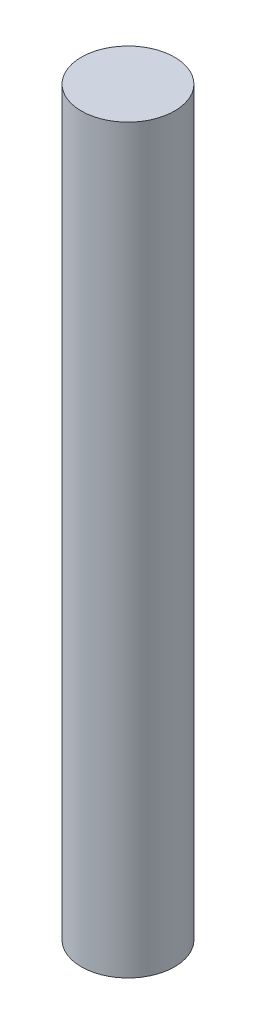
ISO-10303-21;
HEADER;
FILE_DESCRIPTION(('STEP AP214'),'2;1');
FILE_NAME('part.step','',(''),(''),'','','');
FILE_SCHEMA(('AUTOMOTIVE_DESIGN { 1 0 10303 214 1 1 1 1 }'));
ENDSEC;
DATA;
#1=APPLICATION_CONTEXT('core data for automotive mechanical design processes');
#2=APPLICATION_PROTOCOL_DEFINITION('international standard','automotive_design',2000,#1);
#3=PRODUCT_CONTEXT('',#1,'mechanical');
#4=PRODUCT('Part','Part','',(#3));
#5=PRODUCT_RELATED_PRODUCT_CATEGORY('part','',(#4));
#6=PRODUCT_DEFINITION_FORMATION('','',#4);
#7=PRODUCT_DEFINITION_CONTEXT('part definition',#1,'design');
#8=PRODUCT_DEFINITION('design','',#6,#7);
#9=PRODUCT_DEFINITION_SHAPE('','',#8);
#10=(LENGTH_UNIT() NAMED_UNIT(*) SI_UNIT(.MILLI.,.METRE.));
#11=(NAMED_UNIT(*) PLANE_ANGLE_UNIT() SI_UNIT($,.RADIAN.));
#12=(NAMED_UNIT(*) SI_UNIT($,.STERADIAN.) SOLID_ANGLE_UNIT());
#13=UNCERTAINTY_MEASURE_WITH_UNIT(LENGTH_MEASURE(1.E-05),#10,'distance_accuracy_value','');
#14=(GEOMETRIC_REPRESENTATION_CONTEXT(3) GLOBAL_UNCERTAINTY_ASSIGNED_CONTEXT((#13)) GLOBAL_UNIT_ASSIGNED_CONTEXT((#10,
#11,#12)) REPRESENTATION_CONTEXT('',''));
#15=CARTESIAN_POINT('',(0.,0.,0.));
#16=DIRECTION('',(0.,0.,1.));
#17=DIRECTION('',(1.,0.,0.));
#18=AXIS2_PLACEMENT_3D('',#15,#16,#17);
#19=CARTESIAN_POINT('',(0.,33.5,0.));
#20=DIRECTION('',(0.,-1.,0.));
#21=DIRECTION('',(0.,0.,-1.));
#22=AXIS2_PLACEMENT_3D('',#19,#20,#21);
#23=CYLINDRICAL_SURFACE('',#22,2.1082);
#24=CARTESIAN_POINT('',(0.,33.5,0.));
#25=DIRECTION('',(0.,1.,0.));
#26=DIRECTION('',(0.,0.,1.));
#27=AXIS2_PLACEMENT_3D('',#24,#25,#26);
#28=CIRCLE('',#27,2.1082);
#29=CARTESIAN_POINT('',(0.,33.5,2.1082));
#30=VERTEX_POINT('',#29);
#31=EDGE_CURVE('E10',#30,#30,#28,.T.);
#32=ORIENTED_EDGE('',*,*,#31,.F.);
#33=EDGE_LOOP('',(#32));
#34=FACE_BOUND('',#33,.T.);
#35=CARTESIAN_POINT('',(0.,0.,0.));
#36=DIRECTION('',(0.,1.,0.));
#37=DIRECTION('',(0.,0.,1.));
#38=AXIS2_PLACEMENT_3D('',#35,#36,#37);
#39=CIRCLE('',#38,2.1082);
#40=CARTESIAN_POINT('',(0.,0.,2.1082));
#41=VERTEX_POINT('',#40);
#42=EDGE_CURVE('E34',#41,#41,#39,.T.);
#43=ORIENTED_EDGE('',*,*,#42,.T.);
#44=EDGE_LOOP('',(#43));
#45=FACE_BOUND('',#44,.T.);
#46=ADVANCED_FACE('F31',(#34,#45),#23,.T.);
#47=CARTESIAN_POINT('',(0.,33.5,0.));
#48=DIRECTION('',(0.,1.,0.));
#49=DIRECTION('',(0.,0.,1.));
#50=AXIS2_PLACEMENT_3D('',#47,#48,#49);
#51=PLANE('',#50);
#52=ORIENTED_EDGE('',*,*,#31,.T.);
#53=EDGE_LOOP('',(#52));
#54=FACE_BOUND('',#53,.T.);
#55=ADVANCED_FACE('F46',(#54),#51,.T.);
#56=CARTESIAN_POINT('',(0.,0.,0.));
#57=DIRECTION('',(0.,1.,0.));
#58=DIRECTION('',(0.,0.,1.));
#59=AXIS2_PLACEMENT_3D('',#56,#57,#58);
#60=PLANE('',#59);
#61=ORIENTED_EDGE('',*,*,#42,.F.);
#62=EDGE_LOOP('',(#61));
#63=FACE_BOUND('',#62,.T.);
#64=ADVANCED_FACE('F44',(#63),#60,.F.);
#65=CLOSED_SHELL('',(#46,#55,#64));
#66=MANIFOLD_SOLID_BREP('B2',#65);
#67=ADVANCED_BREP_SHAPE_REPRESENTATION('',(#18,#66),#14);
#68=SHAPE_DEFINITION_REPRESENTATION(#9,#67);
ENDSEC;
END-ISO-10303-21;
